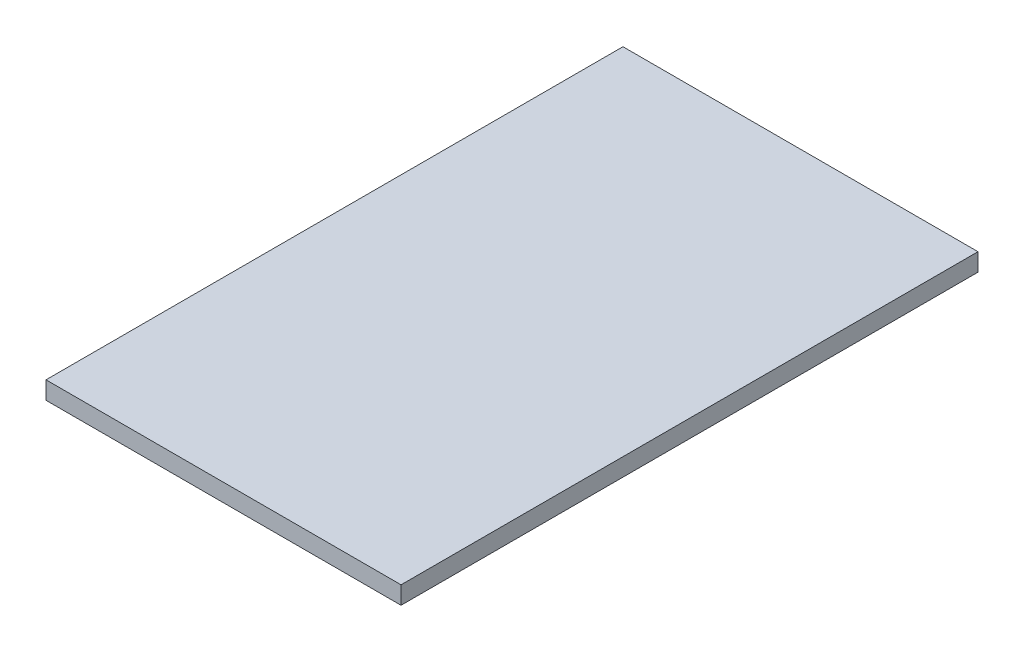
ISO-10303-21;
HEADER;
FILE_DESCRIPTION(('STEP AP214'),'2;1');
FILE_NAME('part.step','',(''),(''),'','','');
FILE_SCHEMA(('AUTOMOTIVE_DESIGN { 1 0 10303 214 1 1 1 1 }'));
ENDSEC;
DATA;
#1=APPLICATION_CONTEXT('core data for automotive mechanical design processes');
#2=APPLICATION_PROTOCOL_DEFINITION('international standard','automotive_design',2000,#1);
#3=PRODUCT_CONTEXT('',#1,'mechanical');
#4=PRODUCT('Part','Part','',(#3));
#5=PRODUCT_RELATED_PRODUCT_CATEGORY('part','',(#4));
#6=PRODUCT_DEFINITION_FORMATION('','',#4);
#7=PRODUCT_DEFINITION_CONTEXT('part definition',#1,'design');
#8=PRODUCT_DEFINITION('design','',#6,#7);
#9=PRODUCT_DEFINITION_SHAPE('','',#8);
#10=(LENGTH_UNIT() NAMED_UNIT(*) SI_UNIT(.MILLI.,.METRE.));
#11=(NAMED_UNIT(*) PLANE_ANGLE_UNIT() SI_UNIT($,.RADIAN.));
#12=(NAMED_UNIT(*) SI_UNIT($,.STERADIAN.) SOLID_ANGLE_UNIT());
#13=UNCERTAINTY_MEASURE_WITH_UNIT(LENGTH_MEASURE(1.E-05),#10,'distance_accuracy_value','');
#14=(GEOMETRIC_REPRESENTATION_CONTEXT(3) GLOBAL_UNCERTAINTY_ASSIGNED_CONTEXT((#13)) GLOBAL_UNIT_ASSIGNED_CONTEXT((#10,
#11,#12)) REPRESENTATION_CONTEXT('',''));
#15=CARTESIAN_POINT('',(0.,0.,0.));
#16=DIRECTION('',(0.,0.,1.));
#17=DIRECTION('',(1.,0.,0.));
#18=AXIS2_PLACEMENT_3D('',#15,#16,#17);
#19=CARTESIAN_POINT('',(-29.7872727272727,2.032,16.3945454545454));
#20=DIRECTION('',(1.,0.,0.));
#21=DIRECTION('',(0.,0.,-1.));
#22=AXIS2_PLACEMENT_3D('',#19,#20,#21);
#23=PLANE('',#22);
#24=DIRECTION('',(0.,0.,1.));
#25=VECTOR('',#24,1.);
#26=CARTESIAN_POINT('',(-29.7872727272727,0.,16.3945454545454));
#27=LINE('',#26,#25);
#28=CARTESIAN_POINT('',(-29.7872727272727,0.,-49.6454545454546));
#29=VERTEX_POINT('',#28);
#30=CARTESIAN_POINT('',(-29.7872727272727,0.,16.3945454545454));
#31=VERTEX_POINT('',#30);
#32=EDGE_CURVE('E107',#29,#31,#27,.T.);
#33=ORIENTED_EDGE('',*,*,#32,.T.);
#34=DIRECTION('',(0.,-1.,0.));
#35=VECTOR('',#34,1.);
#36=CARTESIAN_POINT('',(-29.7872727272727,2.032,16.3945454545454));
#37=LINE('',#36,#35);
#38=CARTESIAN_POINT('',(-29.7872727272727,2.032,16.3945454545454));
#39=VERTEX_POINT('',#38);
#40=EDGE_CURVE('E11',#39,#31,#37,.T.);
#41=ORIENTED_EDGE('',*,*,#40,.F.);
#42=DIRECTION('',(0.,0.,1.));
#43=VECTOR('',#42,1.);
#44=CARTESIAN_POINT('',(-29.7872727272727,2.032,16.3945454545454));
#45=LINE('',#44,#43);
#46=CARTESIAN_POINT('',(-29.7872727272727,2.032,-49.6454545454546));
#47=VERTEX_POINT('',#46);
#48=EDGE_CURVE('E91',#47,#39,#45,.T.);
#49=ORIENTED_EDGE('',*,*,#48,.F.);
#50=DIRECTION('',(0.,-1.,0.));
#51=VECTOR('',#50,1.);
#52=CARTESIAN_POINT('',(-29.7872727272727,2.032,-49.6454545454546));
#53=LINE('',#52,#51);
#54=EDGE_CURVE('E103',#47,#29,#53,.T.);
#55=ORIENTED_EDGE('',*,*,#54,.T.);
#56=EDGE_LOOP('',(#33,#41,#49,#55));
#57=FACE_BOUND('',#56,.T.);
#58=ADVANCED_FACE('F39',(#57),#23,.F.);
#59=CARTESIAN_POINT('',(-29.7872727272727,2.032,16.3945454545454));
#60=DIRECTION('',(0.,0.,-1.));
#61=DIRECTION('',(-1.,0.,0.));
#62=AXIS2_PLACEMENT_3D('',#59,#60,#61);
#63=PLANE('',#62);
#64=DIRECTION('',(1.,0.,0.));
#65=VECTOR('',#64,1.);
#66=CARTESIAN_POINT('',(-29.7872727272727,0.,16.3945454545454));
#67=LINE('',#66,#65);
#68=CARTESIAN_POINT('',(10.8527272727273,0.,16.3945454545454));
#69=VERTEX_POINT('',#68);
#70=EDGE_CURVE('E96',#31,#69,#67,.T.);
#71=ORIENTED_EDGE('',*,*,#70,.T.);
#72=DIRECTION('',(0.,-1.,0.));
#73=VECTOR('',#72,1.);
#74=CARTESIAN_POINT('',(10.8527272727273,2.032,16.3945454545454));
#75=LINE('',#74,#73);
#76=CARTESIAN_POINT('',(10.8527272727273,2.032,16.3945454545454));
#77=VERTEX_POINT('',#76);
#78=EDGE_CURVE('E48',#77,#69,#75,.T.);
#79=ORIENTED_EDGE('',*,*,#78,.F.);
#80=DIRECTION('',(1.,0.,0.));
#81=VECTOR('',#80,1.);
#82=CARTESIAN_POINT('',(-29.7872727272727,2.032,16.3945454545454));
#83=LINE('',#82,#81);
#84=EDGE_CURVE('E86',#39,#77,#83,.T.);
#85=ORIENTED_EDGE('',*,*,#84,.F.);
#86=ORIENTED_EDGE('',*,*,#40,.T.);
#87=EDGE_LOOP('',(#71,#79,#85,#86));
#88=FACE_BOUND('',#87,.T.);
#89=ADVANCED_FACE('F95',(#88),#63,.F.);
#90=CARTESIAN_POINT('',(10.8527272727273,2.032,16.3945454545454));
#91=DIRECTION('',(-1.,0.,0.));
#92=DIRECTION('',(0.,0.,1.));
#93=AXIS2_PLACEMENT_3D('',#90,#91,#92);
#94=PLANE('',#93);
#95=DIRECTION('',(0.,0.,-1.));
#96=VECTOR('',#95,1.);
#97=CARTESIAN_POINT('',(10.8527272727273,0.,16.3945454545454));
#98=LINE('',#97,#96);
#99=CARTESIAN_POINT('',(10.8527272727273,0.,-49.6454545454546));
#100=VERTEX_POINT('',#99);
#101=EDGE_CURVE('E73',#69,#100,#98,.T.);
#102=ORIENTED_EDGE('',*,*,#101,.T.);
#103=DIRECTION('',(0.,-1.,0.));
#104=VECTOR('',#103,1.);
#105=CARTESIAN_POINT('',(10.8527272727273,2.032,-49.6454545454546));
#106=LINE('',#105,#104);
#107=CARTESIAN_POINT('',(10.8527272727273,2.032,-49.6454545454546));
#108=VERTEX_POINT('',#107);
#109=EDGE_CURVE('E98',#108,#100,#106,.T.);
#110=ORIENTED_EDGE('',*,*,#109,.F.);
#111=DIRECTION('',(0.,0.,-1.));
#112=VECTOR('',#111,1.);
#113=CARTESIAN_POINT('',(10.8527272727273,2.032,16.3945454545454));
#114=LINE('',#113,#112);
#115=EDGE_CURVE('E89',#77,#108,#114,.T.);
#116=ORIENTED_EDGE('',*,*,#115,.F.);
#117=ORIENTED_EDGE('',*,*,#78,.T.);
#118=EDGE_LOOP('',(#102,#110,#116,#117));
#119=FACE_BOUND('',#118,.T.);
#120=ADVANCED_FACE('F99',(#119),#94,.F.);
#121=CARTESIAN_POINT('',(-29.7872727272727,2.032,-49.6454545454546));
#122=DIRECTION('',(0.,0.,1.));
#123=DIRECTION('',(1.,0.,0.));
#124=AXIS2_PLACEMENT_3D('',#121,#122,#123);
#125=PLANE('',#124);
#126=DIRECTION('',(-1.,0.,0.));
#127=VECTOR('',#126,1.);
#128=CARTESIAN_POINT('',(-29.7872727272727,0.,-49.6454545454546));
#129=LINE('',#128,#127);
#130=EDGE_CURVE('E79',#100,#29,#129,.T.);
#131=ORIENTED_EDGE('',*,*,#130,.T.);
#132=ORIENTED_EDGE('',*,*,#54,.F.);
#133=DIRECTION('',(-1.,0.,0.));
#134=VECTOR('',#133,1.);
#135=CARTESIAN_POINT('',(-29.7872727272727,2.032,-49.6454545454546));
#136=LINE('',#135,#134);
#137=EDGE_CURVE('E56',#108,#47,#136,.T.);
#138=ORIENTED_EDGE('',*,*,#137,.F.);
#139=ORIENTED_EDGE('',*,*,#109,.T.);
#140=EDGE_LOOP('',(#131,#132,#138,#139));
#141=FACE_BOUND('',#140,.T.);
#142=ADVANCED_FACE('F120',(#141),#125,.F.);
#143=CARTESIAN_POINT('',(0.,2.032,0.));
#144=DIRECTION('',(0.,-1.,0.));
#145=DIRECTION('',(0.,0.,-1.));
#146=AXIS2_PLACEMENT_3D('',#143,#144,#145);
#147=PLANE('',#146);
#148=ORIENTED_EDGE('',*,*,#48,.T.);
#149=ORIENTED_EDGE('',*,*,#84,.T.);
#150=ORIENTED_EDGE('',*,*,#115,.T.);
#151=ORIENTED_EDGE('',*,*,#137,.T.);
#152=EDGE_LOOP('',(#148,#149,#150,#151));
#153=FACE_BOUND('',#152,.T.);
#154=ADVANCED_FACE('F87',(#153),#147,.F.);
#155=CARTESIAN_POINT('',(0.,0.,0.));
#156=DIRECTION('',(0.,-1.,0.));
#157=DIRECTION('',(0.,0.,-1.));
#158=AXIS2_PLACEMENT_3D('',#155,#156,#157);
#159=PLANE('',#158);
#160=ORIENTED_EDGE('',*,*,#32,.F.);
#161=ORIENTED_EDGE('',*,*,#130,.F.);
#162=ORIENTED_EDGE('',*,*,#101,.F.);
#163=ORIENTED_EDGE('',*,*,#70,.F.);
#164=EDGE_LOOP('',(#160,#161,#162,#163));
#165=FACE_BOUND('',#164,.T.);
#166=ADVANCED_FACE('F123',(#165),#159,.T.);
#167=CLOSED_SHELL('',(#58,#89,#120,#142,#154,#166));
#168=MANIFOLD_SOLID_BREP('B2',#167);
#169=ADVANCED_BREP_SHAPE_REPRESENTATION('',(#18,#168),#14);
#170=SHAPE_DEFINITION_REPRESENTATION(#9,#169);
ENDSEC;
END-ISO-10303-21;
